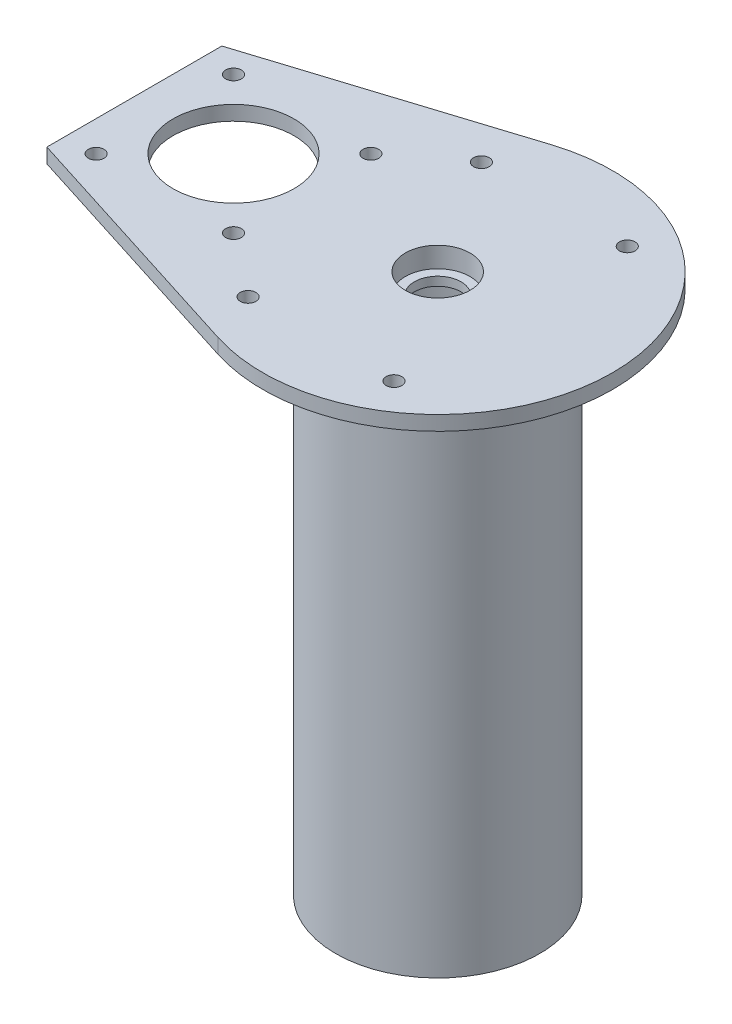
ISO-10303-21;
HEADER;
FILE_DESCRIPTION(('STEP AP214'),'2;1');
FILE_NAME('part.step','',(''),(''),'','','');
FILE_SCHEMA(('AUTOMOTIVE_DESIGN { 1 0 10303 214 1 1 1 1 }'));
ENDSEC;
DATA;
#1=APPLICATION_CONTEXT('core data for automotive mechanical design processes');
#2=APPLICATION_PROTOCOL_DEFINITION('international standard','automotive_design',2000,#1);
#3=PRODUCT_CONTEXT('',#1,'mechanical');
#4=PRODUCT('Part','Part','',(#3));
#5=PRODUCT_RELATED_PRODUCT_CATEGORY('part','',(#4));
#6=PRODUCT_DEFINITION_FORMATION('','',#4);
#7=PRODUCT_DEFINITION_CONTEXT('part definition',#1,'design');
#8=PRODUCT_DEFINITION('design','',#6,#7);
#9=PRODUCT_DEFINITION_SHAPE('','',#8);
#10=(LENGTH_UNIT() NAMED_UNIT(*) SI_UNIT(.MILLI.,.METRE.));
#11=(NAMED_UNIT(*) PLANE_ANGLE_UNIT() SI_UNIT($,.RADIAN.));
#12=(NAMED_UNIT(*) SI_UNIT($,.STERADIAN.) SOLID_ANGLE_UNIT());
#13=UNCERTAINTY_MEASURE_WITH_UNIT(LENGTH_MEASURE(1.E-05),#10,'distance_accuracy_value','');
#14=(GEOMETRIC_REPRESENTATION_CONTEXT(3) GLOBAL_UNCERTAINTY_ASSIGNED_CONTEXT((#13)) GLOBAL_UNIT_ASSIGNED_CONTEXT((#10,
#11,#12)) REPRESENTATION_CONTEXT('',''));
#15=CARTESIAN_POINT('',(0.,0.,0.));
#16=DIRECTION('',(0.,0.,1.));
#17=DIRECTION('',(1.,0.,0.));
#18=AXIS2_PLACEMENT_3D('',#15,#16,#17);
#19=CARTESIAN_POINT('',(0.,0.,0.));
#20=DIRECTION('',(0.,1.,0.));
#21=DIRECTION('',(0.,0.,1.));
#22=AXIS2_PLACEMENT_3D('',#19,#20,#21);
#23=PLANE('',#22);
#24=CARTESIAN_POINT('',(0.,0.,0.));
#25=DIRECTION('',(0.,-1.,0.));
#26=DIRECTION('',(0.,0.,-1.));
#27=AXIS2_PLACEMENT_3D('',#24,#25,#26);
#28=CIRCLE('',#27,30.);
#29=CARTESIAN_POINT('',(0.,0.,-30.));
#30=VERTEX_POINT('',#29);
#31=EDGE_CURVE('E148',#30,#30,#28,.T.);
#32=ORIENTED_EDGE('',*,*,#31,.T.);
#33=EDGE_LOOP('',(#32));
#34=FACE_BOUND('',#33,.T.);
#35=CARTESIAN_POINT('',(0.,0.,0.));
#36=DIRECTION('',(0.,1.,0.));
#37=DIRECTION('',(0.,0.,1.));
#38=AXIS2_PLACEMENT_3D('',#35,#36,#37);
#39=CIRCLE('',#38,16.1);
#40=CARTESIAN_POINT('',(0.,0.,16.1));
#41=VERTEX_POINT('',#40);
#42=EDGE_CURVE('E11',#41,#41,#39,.F.);
#43=ORIENTED_EDGE('',*,*,#42,.F.);
#44=EDGE_LOOP('',(#43));
#45=FACE_BOUND('',#44,.T.);
#46=ADVANCED_FACE('F43',(#34,#45),#23,.F.);
#47=CARTESIAN_POINT('',(0.,-175.,0.));
#48=DIRECTION('',(0.,-1.,0.));
#49=DIRECTION('',(0.,0.,-1.));
#50=AXIS2_PLACEMENT_3D('',#47,#48,#49);
#51=PLANE('',#50);
#52=CARTESIAN_POINT('',(0.,-175.,0.));
#53=DIRECTION('',(0.,-1.,0.));
#54=DIRECTION('',(0.,0.,-1.));
#55=AXIS2_PLACEMENT_3D('',#52,#53,#54);
#56=CIRCLE('',#55,16.1);
#57=CARTESIAN_POINT('',(0.,-175.,-16.1));
#58=VERTEX_POINT('',#57);
#59=EDGE_CURVE('E52',#58,#58,#56,.F.);
#60=ORIENTED_EDGE('',*,*,#59,.F.);
#61=EDGE_LOOP('',(#60));
#62=FACE_BOUND('',#61,.T.);
#63=CARTESIAN_POINT('',(0.,-175.,0.));
#64=DIRECTION('',(0.,-1.,0.));
#65=DIRECTION('',(0.,0.,-1.));
#66=AXIS2_PLACEMENT_3D('',#63,#64,#65);
#67=CIRCLE('',#66,30.);
#68=CARTESIAN_POINT('',(15.,-175.,25.9807621135332));
#69=VERTEX_POINT('',#68);
#70=CARTESIAN_POINT('',(14.9999999999999,-175.,-25.9807621135332));
#71=VERTEX_POINT('',#70);
#72=EDGE_CURVE('E145',#69,#71,#67,.T.);
#73=ORIENTED_EDGE('',*,*,#72,.F.);
#74=CARTESIAN_POINT('',(12.4999999999999,-175.,21.650635094611));
#75=DIRECTION('',(0.,-1.,0.));
#76=DIRECTION('',(0.,0.,-1.));
#77=AXIS2_PLACEMENT_3D('',#74,#75,#76);
#78=CIRCLE('',#77,5.);
#79=CARTESIAN_POINT('',(10.,-175.,17.3205080756887));
#80=VERTEX_POINT('',#79);
#81=EDGE_CURVE('E139',#69,#80,#78,.T.);
#82=ORIENTED_EDGE('',*,*,#81,.T.);
#83=CARTESIAN_POINT('',(0.,-175.,0.));
#84=DIRECTION('',(0.,-1.,0.));
#85=DIRECTION('',(0.,0.,-1.));
#86=AXIS2_PLACEMENT_3D('',#83,#84,#85);
#87=CIRCLE('',#86,20.);
#88=CARTESIAN_POINT('',(9.99999999999988,-175.,-17.3205080756888));
#89=VERTEX_POINT('',#88);
#90=EDGE_CURVE('E134',#80,#89,#87,.F.);
#91=ORIENTED_EDGE('',*,*,#90,.T.);
#92=CARTESIAN_POINT('',(12.5,-175.,-21.650635094611));
#93=DIRECTION('',(0.,-1.,0.));
#94=DIRECTION('',(0.,0.,-1.));
#95=AXIS2_PLACEMENT_3D('',#92,#93,#94);
#96=CIRCLE('',#95,5.);
#97=EDGE_CURVE('E115',#89,#71,#96,.T.);
#98=ORIENTED_EDGE('',*,*,#97,.T.);
#99=EDGE_LOOP('',(#73,#82,#91,#98));
#100=FACE_BOUND('',#99,.T.);
#101=ADVANCED_FACE('F272',(#62,#100),#51,.F.);
#102=CARTESIAN_POINT('',(0.,-180.,0.));
#103=DIRECTION('',(0.,-1.,0.));
#104=DIRECTION('',(0.,0.,-1.));
#105=AXIS2_PLACEMENT_3D('',#102,#103,#104);
#106=PLANE('',#105);
#107=CARTESIAN_POINT('',(0.,-180.,0.));
#108=DIRECTION('',(0.,-1.,0.));
#109=DIRECTION('',(0.,0.,-1.));
#110=AXIS2_PLACEMENT_3D('',#107,#108,#109);
#111=CIRCLE('',#110,11.1);
#112=CARTESIAN_POINT('',(0.,-180.,-11.1));
#113=VERTEX_POINT('',#112);
#114=EDGE_CURVE('E252',#113,#113,#111,.T.);
#115=ORIENTED_EDGE('',*,*,#114,.F.);
#116=EDGE_LOOP('',(#115));
#117=FACE_BOUND('',#116,.T.);
#118=CARTESIAN_POINT('',(0.,-180.,0.));
#119=DIRECTION('',(0.,-1.,0.));
#120=DIRECTION('',(0.,0.,-1.));
#121=AXIS2_PLACEMENT_3D('',#118,#119,#120);
#122=CIRCLE('',#121,35.);
#123=CARTESIAN_POINT('',(0.,-180.,-35.));
#124=VERTEX_POINT('',#123);
#125=EDGE_CURVE('E142',#124,#124,#122,.T.);
#126=ORIENTED_EDGE('',*,*,#125,.T.);
#127=EDGE_LOOP('',(#126));
#128=FACE_BOUND('',#127,.T.);
#129=CARTESIAN_POINT('',(12.4999999999999,-180.,21.650635094611));
#130=DIRECTION('',(0.,-1.,0.));
#131=DIRECTION('',(0.,0.,-1.));
#132=AXIS2_PLACEMENT_3D('',#129,#130,#131);
#133=CIRCLE('',#132,5.);
#134=CARTESIAN_POINT('',(15.,-180.,25.9807621135332));
#135=VERTEX_POINT('',#134);
#136=CARTESIAN_POINT('',(10.,-180.,17.3205080756887));
#137=VERTEX_POINT('',#136);
#138=EDGE_CURVE('E68',#135,#137,#133,.T.);
#139=ORIENTED_EDGE('',*,*,#138,.F.);
#140=CARTESIAN_POINT('',(0.,-180.,0.));
#141=DIRECTION('',(0.,-1.,0.));
#142=DIRECTION('',(0.,0.,-1.));
#143=AXIS2_PLACEMENT_3D('',#140,#141,#142);
#144=CIRCLE('',#143,30.);
#145=CARTESIAN_POINT('',(14.9999999999999,-180.,-25.9807621135332));
#146=VERTEX_POINT('',#145);
#147=EDGE_CURVE('E127',#146,#135,#144,.T.);
#148=ORIENTED_EDGE('',*,*,#147,.F.);
#149=CARTESIAN_POINT('',(12.5,-180.,-21.650635094611));
#150=DIRECTION('',(0.,-1.,0.));
#151=DIRECTION('',(0.,0.,-1.));
#152=AXIS2_PLACEMENT_3D('',#149,#150,#151);
#153=CIRCLE('',#152,5.);
#154=CARTESIAN_POINT('',(9.99999999999988,-180.,-17.3205080756888));
#155=VERTEX_POINT('',#154);
#156=EDGE_CURVE('E112',#155,#146,#153,.T.);
#157=ORIENTED_EDGE('',*,*,#156,.F.);
#158=CARTESIAN_POINT('',(0.,-180.,0.));
#159=DIRECTION('',(0.,1.,0.));
#160=DIRECTION('',(0.,0.,-1.));
#161=AXIS2_PLACEMENT_3D('',#158,#159,#160);
#162=CIRCLE('',#161,20.);
#163=EDGE_CURVE('E121',#137,#155,#162,.T.);
#164=ORIENTED_EDGE('',*,*,#163,.F.);
#165=EDGE_LOOP('',(#139,#148,#157,#164));
#166=FACE_BOUND('',#165,.T.);
#167=ADVANCED_FACE('F125',(#117,#128,#166),#106,.T.);
#168=CARTESIAN_POINT('',(0.,5.,0.));
#169=DIRECTION('',(0.,1.,0.));
#170=DIRECTION('',(0.,0.,1.));
#171=AXIS2_PLACEMENT_3D('',#168,#169,#170);
#172=PLANE('',#171);
#173=CARTESIAN_POINT('',(-25.,5.,40.));
#174=DIRECTION('',(0.,1.,0.));
#175=DIRECTION('',(0.,0.,-1.));
#176=AXIS2_PLACEMENT_3D('',#173,#174,#175);
#177=CIRCLE('',#176,2.685);
#178=CARTESIAN_POINT('',(-25.,5.,37.315));
#179=VERTEX_POINT('',#178);
#180=EDGE_CURVE('E653',#179,#179,#177,.T.);
#181=ORIENTED_EDGE('',*,*,#180,.F.);
#182=EDGE_LOOP('',(#181));
#183=FACE_BOUND('',#182,.T.);
#184=CARTESIAN_POINT('',(25.,5.,40.));
#185=DIRECTION('',(0.,1.,0.));
#186=DIRECTION('',(0.,0.,-1.));
#187=AXIS2_PLACEMENT_3D('',#184,#185,#186);
#188=CIRCLE('',#187,2.685);
#189=CARTESIAN_POINT('',(25.,5.,37.315));
#190=VERTEX_POINT('',#189);
#191=EDGE_CURVE('E654',#190,#190,#188,.T.);
#192=ORIENTED_EDGE('',*,*,#191,.F.);
#193=EDGE_LOOP('',(#192));
#194=FACE_BOUND('',#193,.T.);
#195=CARTESIAN_POINT('',(25.,5.,-40.));
#196=DIRECTION('',(0.,1.,0.));
#197=DIRECTION('',(0.,0.,1.));
#198=AXIS2_PLACEMENT_3D('',#195,#196,#197);
#199=CIRCLE('',#198,2.685);
#200=CARTESIAN_POINT('',(25.,5.,-37.315));
#201=VERTEX_POINT('',#200);
#202=EDGE_CURVE('E657',#201,#201,#199,.T.);
#203=ORIENTED_EDGE('',*,*,#202,.F.);
#204=EDGE_LOOP('',(#203));
#205=FACE_BOUND('',#204,.T.);
#206=CARTESIAN_POINT('',(-25.,5.,-40.));
#207=DIRECTION('',(0.,1.,0.));
#208=DIRECTION('',(0.,0.,1.));
#209=AXIS2_PLACEMENT_3D('',#206,#207,#208);
#210=CIRCLE('',#209,2.685);
#211=CARTESIAN_POINT('',(-25.,5.,-37.315));
#212=VERTEX_POINT('',#211);
#213=EDGE_CURVE('E223',#212,#212,#210,.T.);
#214=ORIENTED_EDGE('',*,*,#213,.F.);
#215=EDGE_LOOP('',(#214));
#216=FACE_BOUND('',#215,.T.);
#217=CARTESIAN_POINT('',(0.,5.,0.));
#218=DIRECTION('',(0.,1.,0.));
#219=DIRECTION('',(0.,0.,1.));
#220=AXIS2_PLACEMENT_3D('',#217,#218,#219);
#221=CIRCLE('',#220,11.1);
#222=CARTESIAN_POINT('',(0.,5.,11.1));
#223=VERTEX_POINT('',#222);
#224=EDGE_CURVE('E155',#223,#223,#221,.T.);
#225=ORIENTED_EDGE('',*,*,#224,.F.);
#226=EDGE_LOOP('',(#225));
#227=FACE_BOUND('',#226,.T.);
#228=CARTESIAN_POINT('',(-93.55,5.,23.55));
#229=DIRECTION('',(0.,1.,0.));
#230=DIRECTION('',(0.,0.,1.));
#231=AXIS2_PLACEMENT_3D('',#228,#229,#230);
#232=CIRCLE('',#231,2.68500000000001);
#233=CARTESIAN_POINT('',(-93.55,5.,26.235));
#234=VERTEX_POINT('',#233);
#235=EDGE_CURVE('E167',#234,#234,#232,.T.);
#236=ORIENTED_EDGE('',*,*,#235,.F.);
#237=EDGE_LOOP('',(#236));
#238=FACE_BOUND('',#237,.T.);
#239=CARTESIAN_POINT('',(-93.55,5.,-23.55));
#240=DIRECTION('',(0.,1.,0.));
#241=DIRECTION('',(0.,0.,1.));
#242=AXIS2_PLACEMENT_3D('',#239,#240,#241);
#243=CIRCLE('',#242,2.68500000000001);
#244=CARTESIAN_POINT('',(-93.55,5.,-20.865));
#245=VERTEX_POINT('',#244);
#246=EDGE_CURVE('E179',#245,#245,#243,.T.);
#247=ORIENTED_EDGE('',*,*,#246,.F.);
#248=EDGE_LOOP('',(#247));
#249=FACE_BOUND('',#248,.T.);
#250=DIRECTION('',(0.,0.,1.));
#251=VECTOR('',#250,1.);
#252=CARTESIAN_POINT('',(-104.,5.,30.));
#253=LINE('',#252,#251);
#254=CARTESIAN_POINT('',(-104.,5.,-30.));
#255=VERTEX_POINT('',#254);
#256=CARTESIAN_POINT('',(-104.,5.,30.));
#257=VERTEX_POINT('',#256);
#258=EDGE_CURVE('E185',#255,#257,#253,.T.);
#259=ORIENTED_EDGE('',*,*,#258,.T.);
#260=DIRECTION('',(0.953332185369574,0.,0.301923408066469));
#261=VECTOR('',#260,1.);
#262=CARTESIAN_POINT('',(-104.,5.,30.));
#263=LINE('',#262,#261);
#264=CARTESIAN_POINT('',(-18.1154044839881,5.,57.1999311221745));
#265=VERTEX_POINT('',#264);
#266=EDGE_CURVE('E188',#257,#265,#263,.T.);
#267=ORIENTED_EDGE('',*,*,#266,.T.);
#268=CARTESIAN_POINT('',(0.,5.,0.));
#269=DIRECTION('',(0.,1.,0.));
#270=DIRECTION('',(0.,0.,1.));
#271=AXIS2_PLACEMENT_3D('',#268,#269,#270);
#272=CIRCLE('',#271,60.);
#273=CARTESIAN_POINT('',(-18.1154044839882,5.,-57.1999311221745));
#274=VERTEX_POINT('',#273);
#275=EDGE_CURVE('E191',#265,#274,#272,.T.);
#276=ORIENTED_EDGE('',*,*,#275,.T.);
#277=DIRECTION('',(-0.953332185369574,0.,0.301923408066469));
#278=VECTOR('',#277,1.);
#279=CARTESIAN_POINT('',(-104.,5.,-30.));
#280=LINE('',#279,#278);
#281=EDGE_CURVE('E193',#274,#255,#280,.T.);
#282=ORIENTED_EDGE('',*,*,#281,.T.);
#283=EDGE_LOOP('',(#259,#267,#276,#282));
#284=FACE_BOUND('',#283,.T.);
#285=CARTESIAN_POINT('',(-46.45,5.,-23.55));
#286=DIRECTION('',(0.,1.,0.));
#287=DIRECTION('',(0.,0.,1.));
#288=AXIS2_PLACEMENT_3D('',#285,#286,#287);
#289=CIRCLE('',#288,2.685);
#290=CARTESIAN_POINT('',(-46.45,5.,-20.865));
#291=VERTEX_POINT('',#290);
#292=EDGE_CURVE('E173',#291,#291,#289,.T.);
#293=ORIENTED_EDGE('',*,*,#292,.F.);
#294=EDGE_LOOP('',(#293));
#295=FACE_BOUND('',#294,.T.);
#296=CARTESIAN_POINT('',(-46.45,5.,23.55));
#297=DIRECTION('',(0.,1.,0.));
#298=DIRECTION('',(0.,0.,1.));
#299=AXIS2_PLACEMENT_3D('',#296,#297,#298);
#300=CIRCLE('',#299,2.685);
#301=CARTESIAN_POINT('',(-46.45,5.,26.235));
#302=VERTEX_POINT('',#301);
#303=EDGE_CURVE('E161',#302,#302,#300,.T.);
#304=ORIENTED_EDGE('',*,*,#303,.F.);
#305=EDGE_LOOP('',(#304));
#306=FACE_BOUND('',#305,.T.);
#307=CARTESIAN_POINT('',(-70.,5.,0.));
#308=DIRECTION('',(0.,1.,0.));
#309=DIRECTION('',(0.,0.,1.));
#310=AXIS2_PLACEMENT_3D('',#307,#308,#309);
#311=CIRCLE('',#310,20.75);
#312=CARTESIAN_POINT('',(-70.,5.,20.75));
#313=VERTEX_POINT('',#312);
#314=EDGE_CURVE('E152',#313,#313,#311,.T.);
#315=ORIENTED_EDGE('',*,*,#314,.F.);
#316=EDGE_LOOP('',(#315));
#317=FACE_BOUND('',#316,.T.);
#318=ADVANCED_FACE('F305',(#183,#194,#205,#216,#227,#238,#249,#284,#295,#306,#317),#172,.T.);
#319=CARTESIAN_POINT('',(-25.,0.,40.));
#320=DIRECTION('',(0.,1.,0.));
#321=DIRECTION('',(0.,0.,1.));
#322=AXIS2_PLACEMENT_3D('',#319,#320,#321);
#323=CIRCLE('',#322,2.685);
#324=CARTESIAN_POINT('',(-25.,0.,42.685));
#325=VERTEX_POINT('',#324);
#326=EDGE_CURVE('E47',#325,#325,#323,.T.);
#327=ORIENTED_EDGE('',*,*,#326,.T.);
#328=EDGE_LOOP('',(#327));
#329=FACE_BOUND('',#328,.T.);
#330=CARTESIAN_POINT('',(25.,0.,40.));
#331=DIRECTION('',(0.,1.,0.));
#332=DIRECTION('',(0.,0.,1.));
#333=AXIS2_PLACEMENT_3D('',#330,#331,#332);
#334=CIRCLE('',#333,2.685);
#335=CARTESIAN_POINT('',(25.,0.,42.685));
#336=VERTEX_POINT('',#335);
#337=EDGE_CURVE('E225',#336,#336,#334,.T.);
#338=ORIENTED_EDGE('',*,*,#337,.T.);
#339=EDGE_LOOP('',(#338));
#340=FACE_BOUND('',#339,.T.);
#341=CARTESIAN_POINT('',(25.,0.,-40.));
#342=DIRECTION('',(0.,1.,0.));
#343=DIRECTION('',(0.,0.,1.));
#344=AXIS2_PLACEMENT_3D('',#341,#342,#343);
#345=CIRCLE('',#344,2.685);
#346=CARTESIAN_POINT('',(25.,0.,-37.315));
#347=VERTEX_POINT('',#346);
#348=EDGE_CURVE('E222',#347,#347,#345,.T.);
#349=ORIENTED_EDGE('',*,*,#348,.T.);
#350=EDGE_LOOP('',(#349));
#351=FACE_BOUND('',#350,.T.);
#352=CARTESIAN_POINT('',(-25.,0.,-40.));
#353=DIRECTION('',(0.,1.,0.));
#354=DIRECTION('',(0.,0.,1.));
#355=AXIS2_PLACEMENT_3D('',#352,#353,#354);
#356=CIRCLE('',#355,2.685);
#357=CARTESIAN_POINT('',(-25.,0.,-37.315));
#358=VERTEX_POINT('',#357);
#359=EDGE_CURVE('E219',#358,#358,#356,.T.);
#360=ORIENTED_EDGE('',*,*,#359,.T.);
#361=EDGE_LOOP('',(#360));
#362=FACE_BOUND('',#361,.T.);
#363=CARTESIAN_POINT('',(0.,0.,0.));
#364=DIRECTION('',(0.,1.,0.));
#365=DIRECTION('',(0.,0.,1.));
#366=AXIS2_PLACEMENT_3D('',#363,#364,#365);
#367=CIRCLE('',#366,35.);
#368=CARTESIAN_POINT('',(0.,0.,35.));
#369=VERTEX_POINT('',#368);
#370=EDGE_CURVE('E214',#369,#369,#367,.F.);
#371=ORIENTED_EDGE('',*,*,#370,.F.);
#372=EDGE_LOOP('',(#371));
#373=FACE_BOUND('',#372,.T.);
#374=DIRECTION('',(0.,0.,1.));
#375=VECTOR('',#374,1.);
#376=CARTESIAN_POINT('',(-104.,0.,30.));
#377=LINE('',#376,#375);
#378=CARTESIAN_POINT('',(-104.,0.,-30.));
#379=VERTEX_POINT('',#378);
#380=CARTESIAN_POINT('',(-104.,0.,30.));
#381=VERTEX_POINT('',#380);
#382=EDGE_CURVE('E182',#379,#381,#377,.T.);
#383=ORIENTED_EDGE('',*,*,#382,.F.);
#384=DIRECTION('',(-0.953332185369574,0.,0.301923408066469));
#385=VECTOR('',#384,1.);
#386=CARTESIAN_POINT('',(-104.,0.,-30.));
#387=LINE('',#386,#385);
#388=CARTESIAN_POINT('',(-18.1154044839882,0.,-57.1999311221745));
#389=VERTEX_POINT('',#388);
#390=EDGE_CURVE('E189',#389,#379,#387,.T.);
#391=ORIENTED_EDGE('',*,*,#390,.F.);
#392=CARTESIAN_POINT('',(0.,0.,0.));
#393=DIRECTION('',(0.,1.,0.));
#394=DIRECTION('',(0.,0.,1.));
#395=AXIS2_PLACEMENT_3D('',#392,#393,#394);
#396=CIRCLE('',#395,60.);
#397=CARTESIAN_POINT('',(-18.1154044839881,0.,57.1999311221745));
#398=VERTEX_POINT('',#397);
#399=EDGE_CURVE('E200',#398,#389,#396,.T.);
#400=ORIENTED_EDGE('',*,*,#399,.F.);
#401=DIRECTION('',(0.953332185369574,0.,0.301923408066469));
#402=VECTOR('',#401,1.);
#403=CARTESIAN_POINT('',(-104.,0.,30.));
#404=LINE('',#403,#402);
#405=EDGE_CURVE('E198',#381,#398,#404,.T.);
#406=ORIENTED_EDGE('',*,*,#405,.F.);
#407=EDGE_LOOP('',(#383,#391,#400,#406));
#408=FACE_BOUND('',#407,.T.);
#409=CARTESIAN_POINT('',(-93.55,0.,-23.55));
#410=DIRECTION('',(0.,1.,0.));
#411=DIRECTION('',(0.,0.,1.));
#412=AXIS2_PLACEMENT_3D('',#409,#410,#411);
#413=CIRCLE('',#412,2.68500000000001);
#414=CARTESIAN_POINT('',(-93.55,0.,-20.865));
#415=VERTEX_POINT('',#414);
#416=EDGE_CURVE('E176',#415,#415,#413,.T.);
#417=ORIENTED_EDGE('',*,*,#416,.T.);
#418=EDGE_LOOP('',(#417));
#419=FACE_BOUND('',#418,.T.);
#420=CARTESIAN_POINT('',(-46.45,0.,-23.55));
#421=DIRECTION('',(0.,1.,0.));
#422=DIRECTION('',(0.,0.,1.));
#423=AXIS2_PLACEMENT_3D('',#420,#421,#422);
#424=CIRCLE('',#423,2.685);
#425=CARTESIAN_POINT('',(-46.45,0.,-20.865));
#426=VERTEX_POINT('',#425);
#427=EDGE_CURVE('E170',#426,#426,#424,.T.);
#428=ORIENTED_EDGE('',*,*,#427,.T.);
#429=EDGE_LOOP('',(#428));
#430=FACE_BOUND('',#429,.T.);
#431=CARTESIAN_POINT('',(-93.55,0.,23.55));
#432=DIRECTION('',(0.,1.,0.));
#433=DIRECTION('',(0.,0.,1.));
#434=AXIS2_PLACEMENT_3D('',#431,#432,#433);
#435=CIRCLE('',#434,2.68500000000001);
#436=CARTESIAN_POINT('',(-93.55,0.,26.235));
#437=VERTEX_POINT('',#436);
#438=EDGE_CURVE('E164',#437,#437,#435,.T.);
#439=ORIENTED_EDGE('',*,*,#438,.T.);
#440=EDGE_LOOP('',(#439));
#441=FACE_BOUND('',#440,.T.);
#442=CARTESIAN_POINT('',(-46.45,0.,23.55));
#443=DIRECTION('',(0.,1.,0.));
#444=DIRECTION('',(0.,0.,1.));
#445=AXIS2_PLACEMENT_3D('',#442,#443,#444);
#446=CIRCLE('',#445,2.685);
#447=CARTESIAN_POINT('',(-46.45,0.,26.235));
#448=VERTEX_POINT('',#447);
#449=EDGE_CURVE('E160',#448,#448,#446,.T.);
#450=ORIENTED_EDGE('',*,*,#449,.T.);
#451=EDGE_LOOP('',(#450));
#452=FACE_BOUND('',#451,.T.);
#453=CARTESIAN_POINT('',(-70.,0.,0.));
#454=DIRECTION('',(0.,1.,0.));
#455=DIRECTION('',(0.,0.,1.));
#456=AXIS2_PLACEMENT_3D('',#453,#454,#455);
#457=CIRCLE('',#456,20.75);
#458=CARTESIAN_POINT('',(-70.,0.,20.75));
#459=VERTEX_POINT('',#458);
#460=EDGE_CURVE('E151',#459,#459,#457,.T.);
#461=ORIENTED_EDGE('',*,*,#460,.T.);
#462=EDGE_LOOP('',(#461));
#463=FACE_BOUND('',#462,.T.);
#464=ADVANCED_FACE('F296',(#329,#340,#351,#362,#373,#408,#419,#430,#441,#452,#463),#23,.F.);
#465=CARTESIAN_POINT('',(-104.,5.,30.));
#466=DIRECTION('',(1.,0.,0.));
#467=DIRECTION('',(0.,0.,-1.));
#468=AXIS2_PLACEMENT_3D('',#465,#466,#467);
#469=PLANE('',#468);
#470=ORIENTED_EDGE('',*,*,#382,.T.);
#471=DIRECTION('',(0.,-1.,0.));
#472=VECTOR('',#471,1.);
#473=CARTESIAN_POINT('',(-104.,5.,30.));
#474=LINE('',#473,#472);
#475=EDGE_CURVE('E211',#257,#381,#474,.T.);
#476=ORIENTED_EDGE('',*,*,#475,.F.);
#477=ORIENTED_EDGE('',*,*,#258,.F.);
#478=DIRECTION('',(0.,-1.,0.));
#479=VECTOR('',#478,1.);
#480=CARTESIAN_POINT('',(-104.,5.,-30.));
#481=LINE('',#480,#479);
#482=EDGE_CURVE('E195',#255,#379,#481,.T.);
#483=ORIENTED_EDGE('',*,*,#482,.T.);
#484=EDGE_LOOP('',(#470,#476,#477,#483));
#485=FACE_BOUND('',#484,.T.);
#486=ADVANCED_FACE('F45',(#485),#469,.F.);
#487=CARTESIAN_POINT('',(-104.,5.,30.));
#488=DIRECTION('',(0.301923408066469,0.,-0.953332185369574));
#489=DIRECTION('',(-0.953332185369574,0.,-0.301923408066469));
#490=AXIS2_PLACEMENT_3D('',#487,#488,#489);
#491=PLANE('',#490);
#492=ORIENTED_EDGE('',*,*,#405,.T.);
#493=DIRECTION('',(0.,-1.,0.));
#494=VECTOR('',#493,1.);
#495=CARTESIAN_POINT('',(-18.1154044839881,5.,57.1999311221745));
#496=LINE('',#495,#494);
#497=EDGE_CURVE('E208',#265,#398,#496,.T.);
#498=ORIENTED_EDGE('',*,*,#497,.F.);
#499=ORIENTED_EDGE('',*,*,#266,.F.);
#500=ORIENTED_EDGE('',*,*,#475,.T.);
#501=EDGE_LOOP('',(#492,#498,#499,#500));
#502=FACE_BOUND('',#501,.T.);
#503=ADVANCED_FACE('F311',(#502),#491,.F.);
#504=CARTESIAN_POINT('',(0.,5.,0.));
#505=DIRECTION('',(0.,-1.,0.));
#506=DIRECTION('',(0.,0.,-1.));
#507=AXIS2_PLACEMENT_3D('',#504,#505,#506);
#508=CYLINDRICAL_SURFACE('',#507,60.);
#509=ORIENTED_EDGE('',*,*,#399,.T.);
#510=DIRECTION('',(0.,-1.,0.));
#511=VECTOR('',#510,1.);
#512=CARTESIAN_POINT('',(-18.1154044839882,5.,-57.1999311221745));
#513=LINE('',#512,#511);
#514=EDGE_CURVE('E205',#274,#389,#513,.T.);
#515=ORIENTED_EDGE('',*,*,#514,.F.);
#516=ORIENTED_EDGE('',*,*,#275,.F.);
#517=ORIENTED_EDGE('',*,*,#497,.T.);
#518=EDGE_LOOP('',(#509,#515,#516,#517));
#519=FACE_BOUND('',#518,.T.);
#520=ADVANCED_FACE('F366',(#519),#508,.T.);
#521=CARTESIAN_POINT('',(-104.,5.,-30.));
#522=DIRECTION('',(0.301923408066469,0.,0.953332185369574));
#523=DIRECTION('',(0.953332185369574,0.,-0.301923408066469));
#524=AXIS2_PLACEMENT_3D('',#521,#522,#523);
#525=PLANE('',#524);
#526=ORIENTED_EDGE('',*,*,#390,.T.);
#527=ORIENTED_EDGE('',*,*,#482,.F.);
#528=ORIENTED_EDGE('',*,*,#281,.F.);
#529=ORIENTED_EDGE('',*,*,#514,.T.);
#530=EDGE_LOOP('',(#526,#527,#528,#529));
#531=FACE_BOUND('',#530,.T.);
#532=ADVANCED_FACE('F361',(#531),#525,.F.);
#533=CARTESIAN_POINT('',(-93.55,5.,-23.55));
#534=DIRECTION('',(0.,-1.,0.));
#535=DIRECTION('',(0.,0.,-1.));
#536=AXIS2_PLACEMENT_3D('',#533,#534,#535);
#537=CYLINDRICAL_SURFACE('',#536,2.68500000000001);
#538=ORIENTED_EDGE('',*,*,#246,.T.);
#539=EDGE_LOOP('',(#538));
#540=FACE_BOUND('',#539,.T.);
#541=ORIENTED_EDGE('',*,*,#416,.F.);
#542=EDGE_LOOP('',(#541));
#543=FACE_BOUND('',#542,.T.);
#544=ADVANCED_FACE('F358',(#540,#543),#537,.F.);
#545=CARTESIAN_POINT('',(-46.45,5.,-23.55));
#546=DIRECTION('',(0.,-1.,0.));
#547=DIRECTION('',(0.,0.,-1.));
#548=AXIS2_PLACEMENT_3D('',#545,#546,#547);
#549=CYLINDRICAL_SURFACE('',#548,2.685);
#550=ORIENTED_EDGE('',*,*,#292,.T.);
#551=EDGE_LOOP('',(#550));
#552=FACE_BOUND('',#551,.T.);
#553=ORIENTED_EDGE('',*,*,#427,.F.);
#554=EDGE_LOOP('',(#553));
#555=FACE_BOUND('',#554,.T.);
#556=ADVANCED_FACE('F354',(#552,#555),#549,.F.);
#557=CARTESIAN_POINT('',(-93.55,5.,23.55));
#558=DIRECTION('',(0.,-1.,0.));
#559=DIRECTION('',(0.,0.,-1.));
#560=AXIS2_PLACEMENT_3D('',#557,#558,#559);
#561=CYLINDRICAL_SURFACE('',#560,2.68500000000001);
#562=ORIENTED_EDGE('',*,*,#235,.T.);
#563=EDGE_LOOP('',(#562));
#564=FACE_BOUND('',#563,.T.);
#565=ORIENTED_EDGE('',*,*,#438,.F.);
#566=EDGE_LOOP('',(#565));
#567=FACE_BOUND('',#566,.T.);
#568=ADVANCED_FACE('F350',(#564,#567),#561,.F.);
#569=CARTESIAN_POINT('',(-46.45,5.,23.55));
#570=DIRECTION('',(0.,-1.,0.));
#571=DIRECTION('',(0.,0.,-1.));
#572=AXIS2_PLACEMENT_3D('',#569,#570,#571);
#573=CYLINDRICAL_SURFACE('',#572,2.685);
#574=ORIENTED_EDGE('',*,*,#303,.T.);
#575=EDGE_LOOP('',(#574));
#576=FACE_BOUND('',#575,.T.);
#577=ORIENTED_EDGE('',*,*,#449,.F.);
#578=EDGE_LOOP('',(#577));
#579=FACE_BOUND('',#578,.T.);
#580=ADVANCED_FACE('F345',(#576,#579),#573,.F.);
#581=CARTESIAN_POINT('',(0.,5.,0.));
#582=DIRECTION('',(0.,-1.,0.));
#583=DIRECTION('',(0.,0.,-1.));
#584=AXIS2_PLACEMENT_3D('',#581,#582,#583);
#585=CYLINDRICAL_SURFACE('',#584,11.1);
#586=ORIENTED_EDGE('',*,*,#224,.T.);
#587=EDGE_LOOP('',(#586));
#588=FACE_BOUND('',#587,.T.);
#589=CARTESIAN_POINT('',(0.,-2.,0.));
#590=DIRECTION('',(0.,-1.,0.));
#591=DIRECTION('',(0.,0.,-1.));
#592=AXIS2_PLACEMENT_3D('',#589,#590,#591);
#593=CIRCLE('',#592,11.1);
#594=CARTESIAN_POINT('',(0.,-2.,-11.1));
#595=VERTEX_POINT('',#594);
#596=EDGE_CURVE('E245',#595,#595,#593,.T.);
#597=ORIENTED_EDGE('',*,*,#596,.T.);
#598=EDGE_LOOP('',(#597));
#599=FACE_BOUND('',#598,.T.);
#600=ADVANCED_FACE('F336',(#588,#599),#585,.F.);
#601=CARTESIAN_POINT('',(-70.,5.,0.));
#602=DIRECTION('',(0.,-1.,0.));
#603=DIRECTION('',(0.,0.,-1.));
#604=AXIS2_PLACEMENT_3D('',#601,#602,#603);
#605=CYLINDRICAL_SURFACE('',#604,20.75);
#606=ORIENTED_EDGE('',*,*,#314,.T.);
#607=EDGE_LOOP('',(#606));
#608=FACE_BOUND('',#607,.T.);
#609=ORIENTED_EDGE('',*,*,#460,.F.);
#610=EDGE_LOOP('',(#609));
#611=FACE_BOUND('',#610,.T.);
#612=ADVANCED_FACE('F334',(#608,#611),#605,.F.);
#613=CARTESIAN_POINT('',(0.,-175.,0.));
#614=DIRECTION('',(0.,1.,0.));
#615=DIRECTION('',(0.,0.,1.));
#616=AXIS2_PLACEMENT_3D('',#613,#614,#615);
#617=CYLINDRICAL_SURFACE('',#616,35.);
#618=ORIENTED_EDGE('',*,*,#370,.T.);
#619=EDGE_LOOP('',(#618));
#620=FACE_BOUND('',#619,.T.);
#621=ORIENTED_EDGE('',*,*,#125,.F.);
#622=EDGE_LOOP('',(#621));
#623=FACE_BOUND('',#622,.T.);
#624=ADVANCED_FACE('F289',(#620,#623),#617,.T.);
#625=CARTESIAN_POINT('',(0.,-175.,0.));
#626=DIRECTION('',(0.,1.,0.));
#627=DIRECTION('',(0.,0.,1.));
#628=AXIS2_PLACEMENT_3D('',#625,#626,#627);
#629=CYLINDRICAL_SURFACE('',#628,30.);
#630=DIRECTION('',(0.,-1.,0.));
#631=VECTOR('',#630,1.);
#632=CARTESIAN_POINT('',(15.,-174.,25.9807621135332));
#633=LINE('',#632,#631);
#634=EDGE_CURVE('E132',#69,#135,#633,.T.);
#635=ORIENTED_EDGE('',*,*,#634,.F.);
#636=ORIENTED_EDGE('',*,*,#72,.T.);
#637=DIRECTION('',(0.,-1.,0.));
#638=VECTOR('',#637,1.);
#639=CARTESIAN_POINT('',(14.9999999999999,-174.,-25.9807621135332));
#640=LINE('',#639,#638);
#641=EDGE_CURVE('E117',#71,#146,#640,.T.);
#642=ORIENTED_EDGE('',*,*,#641,.T.);
#643=ORIENTED_EDGE('',*,*,#147,.T.);
#644=EDGE_LOOP('',(#635,#636,#642,#643));
#645=FACE_BOUND('',#644,.T.);
#646=ORIENTED_EDGE('',*,*,#31,.F.);
#647=EDGE_LOOP('',(#646));
#648=FACE_BOUND('',#647,.T.);
#649=ADVANCED_FACE('F279',(#645,#648),#629,.F.);
#650=CARTESIAN_POINT('',(12.4999999999999,-174.,21.650635094611));
#651=DIRECTION('',(0.,-1.,0.));
#652=DIRECTION('',(0.,0.,-1.));
#653=AXIS2_PLACEMENT_3D('',#650,#651,#652);
#654=CYLINDRICAL_SURFACE('',#653,5.);
#655=ORIENTED_EDGE('',*,*,#634,.T.);
#656=ORIENTED_EDGE('',*,*,#138,.T.);
#657=DIRECTION('',(0.,-1.,0.));
#658=VECTOR('',#657,1.);
#659=CARTESIAN_POINT('',(10.,-174.,17.3205080756887));
#660=LINE('',#659,#658);
#661=EDGE_CURVE('E118',#80,#137,#660,.T.);
#662=ORIENTED_EDGE('',*,*,#661,.F.);
#663=ORIENTED_EDGE('',*,*,#81,.F.);
#664=EDGE_LOOP('',(#655,#656,#662,#663));
#665=FACE_BOUND('',#664,.T.);
#666=ADVANCED_FACE('F281',(#665),#654,.F.);
#667=CARTESIAN_POINT('',(12.5,-174.,-21.650635094611));
#668=DIRECTION('',(0.,-1.,0.));
#669=DIRECTION('',(0.,0.,-1.));
#670=AXIS2_PLACEMENT_3D('',#667,#668,#669);
#671=CYLINDRICAL_SURFACE('',#670,5.);
#672=DIRECTION('',(0.,-1.,0.));
#673=VECTOR('',#672,1.);
#674=CARTESIAN_POINT('',(9.99999999999988,-174.,-17.3205080756888));
#675=LINE('',#674,#673);
#676=EDGE_CURVE('E60',#89,#155,#675,.T.);
#677=ORIENTED_EDGE('',*,*,#676,.T.);
#678=ORIENTED_EDGE('',*,*,#156,.T.);
#679=ORIENTED_EDGE('',*,*,#641,.F.);
#680=ORIENTED_EDGE('',*,*,#97,.F.);
#681=EDGE_LOOP('',(#677,#678,#679,#680));
#682=FACE_BOUND('',#681,.T.);
#683=ADVANCED_FACE('F110',(#682),#671,.F.);
#684=CARTESIAN_POINT('',(0.,-174.,0.));
#685=DIRECTION('',(0.,-1.,0.));
#686=DIRECTION('',(0.,0.,-1.));
#687=AXIS2_PLACEMENT_3D('',#684,#685,#686);
#688=CYLINDRICAL_SURFACE('',#687,20.);
#689=ORIENTED_EDGE('',*,*,#661,.T.);
#690=ORIENTED_EDGE('',*,*,#163,.T.);
#691=ORIENTED_EDGE('',*,*,#676,.F.);
#692=ORIENTED_EDGE('',*,*,#90,.F.);
#693=EDGE_LOOP('',(#689,#690,#691,#692));
#694=FACE_BOUND('',#693,.T.);
#695=ADVANCED_FACE('F122',(#694),#688,.T.);
#696=CARTESIAN_POINT('',(0.,-170.,0.));
#697=DIRECTION('',(0.,-1.,0.));
#698=DIRECTION('',(0.,0.,-1.));
#699=AXIS2_PLACEMENT_3D('',#696,#697,#698);
#700=CYLINDRICAL_SURFACE('',#699,16.1);
#701=CARTESIAN_POINT('',(0.,-170.,0.));
#702=DIRECTION('',(0.,1.,0.));
#703=DIRECTION('',(0.,0.,1.));
#704=AXIS2_PLACEMENT_3D('',#701,#702,#703);
#705=CIRCLE('',#704,16.1);
#706=CARTESIAN_POINT('',(0.,-170.,16.1));
#707=VERTEX_POINT('',#706);
#708=EDGE_CURVE('E258',#707,#707,#705,.T.);
#709=ORIENTED_EDGE('',*,*,#708,.F.);
#710=EDGE_LOOP('',(#709));
#711=FACE_BOUND('',#710,.T.);
#712=ORIENTED_EDGE('',*,*,#59,.T.);
#713=EDGE_LOOP('',(#712));
#714=FACE_BOUND('',#713,.T.);
#715=ADVANCED_FACE('F266',(#711,#714),#700,.T.);
#716=CARTESIAN_POINT('',(0.,-170.,0.));
#717=DIRECTION('',(0.,1.,0.));
#718=DIRECTION('',(0.,0.,1.));
#719=AXIS2_PLACEMENT_3D('',#716,#717,#718);
#720=PLANE('',#719);
#721=CARTESIAN_POINT('',(0.,-170.,0.));
#722=DIRECTION('',(0.,1.,0.));
#723=DIRECTION('',(0.,0.,1.));
#724=AXIS2_PLACEMENT_3D('',#721,#722,#723);
#725=CIRCLE('',#724,8.);
#726=CARTESIAN_POINT('',(0.,-170.,8.));
#727=VERTEX_POINT('',#726);
#728=EDGE_CURVE('E248',#727,#727,#725,.F.);
#729=ORIENTED_EDGE('',*,*,#728,.T.);
#730=EDGE_LOOP('',(#729));
#731=FACE_BOUND('',#730,.T.);
#732=ORIENTED_EDGE('',*,*,#708,.T.);
#733=EDGE_LOOP('',(#732));
#734=FACE_BOUND('',#733,.T.);
#735=ADVANCED_FACE('F264',(#731,#734),#720,.T.);
#736=CARTESIAN_POINT('',(0.,-173.,0.));
#737=DIRECTION('',(0.,-1.,0.));
#738=DIRECTION('',(0.,0.,-1.));
#739=AXIS2_PLACEMENT_3D('',#736,#737,#738);
#740=CYLINDRICAL_SURFACE('',#739,11.1);
#741=CARTESIAN_POINT('',(0.,-173.,0.));
#742=DIRECTION('',(0.,-1.,0.));
#743=DIRECTION('',(0.,0.,-1.));
#744=AXIS2_PLACEMENT_3D('',#741,#742,#743);
#745=CIRCLE('',#744,11.1);
#746=CARTESIAN_POINT('',(0.,-173.,-11.1));
#747=VERTEX_POINT('',#746);
#748=EDGE_CURVE('E255',#747,#747,#745,.T.);
#749=ORIENTED_EDGE('',*,*,#748,.F.);
#750=EDGE_LOOP('',(#749));
#751=FACE_BOUND('',#750,.T.);
#752=ORIENTED_EDGE('',*,*,#114,.T.);
#753=EDGE_LOOP('',(#752));
#754=FACE_BOUND('',#753,.T.);
#755=ADVANCED_FACE('F521',(#751,#754),#740,.F.);
#756=CARTESIAN_POINT('',(0.,-173.,0.));
#757=DIRECTION('',(0.,-1.,0.));
#758=DIRECTION('',(0.,0.,-1.));
#759=AXIS2_PLACEMENT_3D('',#756,#757,#758);
#760=PLANE('',#759);
#761=CARTESIAN_POINT('',(0.,-173.,0.));
#762=DIRECTION('',(0.,-1.,0.));
#763=DIRECTION('',(0.,0.,-1.));
#764=AXIS2_PLACEMENT_3D('',#761,#762,#763);
#765=CIRCLE('',#764,8.);
#766=CARTESIAN_POINT('',(0.,-173.,-8.));
#767=VERTEX_POINT('',#766);
#768=EDGE_CURVE('E249',#767,#767,#765,.T.);
#769=ORIENTED_EDGE('',*,*,#768,.F.);
#770=EDGE_LOOP('',(#769));
#771=FACE_BOUND('',#770,.T.);
#772=ORIENTED_EDGE('',*,*,#748,.T.);
#773=EDGE_LOOP('',(#772));
#774=FACE_BOUND('',#773,.T.);
#775=ADVANCED_FACE('F517',(#771,#774),#760,.T.);
#776=CARTESIAN_POINT('',(0.,5.00100000000001,0.));
#777=DIRECTION('',(0.,-1.,0.));
#778=DIRECTION('',(0.,0.,-1.));
#779=AXIS2_PLACEMENT_3D('',#776,#777,#778);
#780=CYLINDRICAL_SURFACE('',#779,8.);
#781=ORIENTED_EDGE('',*,*,#728,.F.);
#782=EDGE_LOOP('',(#781));
#783=FACE_BOUND('',#782,.T.);
#784=ORIENTED_EDGE('',*,*,#768,.T.);
#785=EDGE_LOOP('',(#784));
#786=FACE_BOUND('',#785,.T.);
#787=ADVANCED_FACE('F448',(#783,#786),#780,.F.);
#788=CARTESIAN_POINT('',(0.,-2.,0.));
#789=DIRECTION('',(0.,1.,0.));
#790=DIRECTION('',(0.,0.,1.));
#791=AXIS2_PLACEMENT_3D('',#788,#789,#790);
#792=CYLINDRICAL_SURFACE('',#791,16.1);
#793=ORIENTED_EDGE('',*,*,#42,.T.);
#794=EDGE_LOOP('',(#793));
#795=FACE_BOUND('',#794,.T.);
#796=CARTESIAN_POINT('',(0.,-5.,0.));
#797=DIRECTION('',(0.,-1.,0.));
#798=DIRECTION('',(0.,0.,-1.));
#799=AXIS2_PLACEMENT_3D('',#796,#797,#798);
#800=CIRCLE('',#799,16.1);
#801=CARTESIAN_POINT('',(0.,-5.,-16.1));
#802=VERTEX_POINT('',#801);
#803=EDGE_CURVE('E239',#802,#802,#800,.T.);
#804=ORIENTED_EDGE('',*,*,#803,.F.);
#805=EDGE_LOOP('',(#804));
#806=FACE_BOUND('',#805,.T.);
#807=ADVANCED_FACE('F441',(#795,#806),#792,.T.);
#808=CARTESIAN_POINT('',(0.,-2.,0.));
#809=DIRECTION('',(0.,-1.,0.));
#810=DIRECTION('',(0.,0.,-1.));
#811=AXIS2_PLACEMENT_3D('',#808,#809,#810);
#812=PLANE('',#811);
#813=CARTESIAN_POINT('',(0.,-2.,0.));
#814=DIRECTION('',(0.,-1.,0.));
#815=DIRECTION('',(0.,0.,-1.));
#816=AXIS2_PLACEMENT_3D('',#813,#814,#815);
#817=CIRCLE('',#816,8.);
#818=CARTESIAN_POINT('',(0.,-2.,-8.));
#819=VERTEX_POINT('',#818);
#820=EDGE_CURVE('E230',#819,#819,#817,.T.);
#821=ORIENTED_EDGE('',*,*,#820,.T.);
#822=EDGE_LOOP('',(#821));
#823=FACE_BOUND('',#822,.T.);
#824=ORIENTED_EDGE('',*,*,#596,.F.);
#825=EDGE_LOOP('',(#824));
#826=FACE_BOUND('',#825,.T.);
#827=ADVANCED_FACE('F432',(#823,#826),#812,.F.);
#828=CARTESIAN_POINT('',(0.,-5.,0.));
#829=DIRECTION('',(0.,-1.,0.));
#830=DIRECTION('',(0.,0.,-1.));
#831=AXIS2_PLACEMENT_3D('',#828,#829,#830);
#832=PLANE('',#831);
#833=ORIENTED_EDGE('',*,*,#803,.T.);
#834=EDGE_LOOP('',(#833));
#835=FACE_BOUND('',#834,.T.);
#836=CARTESIAN_POINT('',(0.,-5.,0.));
#837=DIRECTION('',(0.,-1.,0.));
#838=DIRECTION('',(0.,0.,-1.));
#839=AXIS2_PLACEMENT_3D('',#836,#837,#838);
#840=CIRCLE('',#839,8.);
#841=CARTESIAN_POINT('',(0.,-5.,-8.));
#842=VERTEX_POINT('',#841);
#843=EDGE_CURVE('E234',#842,#842,#840,.T.);
#844=ORIENTED_EDGE('',*,*,#843,.F.);
#845=EDGE_LOOP('',(#844));
#846=FACE_BOUND('',#845,.T.);
#847=ADVANCED_FACE('F422',(#835,#846),#832,.T.);
#848=CARTESIAN_POINT('',(0.,-5.,0.));
#849=DIRECTION('',(0.,1.,0.));
#850=DIRECTION('',(0.,0.,1.));
#851=AXIS2_PLACEMENT_3D('',#848,#849,#850);
#852=CYLINDRICAL_SURFACE('',#851,8.);
#853=ORIENTED_EDGE('',*,*,#843,.T.);
#854=EDGE_LOOP('',(#853));
#855=FACE_BOUND('',#854,.T.);
#856=ORIENTED_EDGE('',*,*,#820,.F.);
#857=EDGE_LOOP('',(#856));
#858=FACE_BOUND('',#857,.T.);
#859=ADVANCED_FACE('F417',(#855,#858),#852,.F.);
#860=CARTESIAN_POINT('',(-25.,-180.,-40.));
#861=DIRECTION('',(0.,1.,0.));
#862=DIRECTION('',(0.,0.,1.));
#863=AXIS2_PLACEMENT_3D('',#860,#861,#862);
#864=CYLINDRICAL_SURFACE('',#863,2.685);
#865=ORIENTED_EDGE('',*,*,#213,.T.);
#866=EDGE_LOOP('',(#865));
#867=FACE_BOUND('',#866,.T.);
#868=ORIENTED_EDGE('',*,*,#359,.F.);
#869=EDGE_LOOP('',(#868));
#870=FACE_BOUND('',#869,.T.);
#871=ADVANCED_FACE('F421',(#867,#870),#864,.F.);
#872=CARTESIAN_POINT('',(25.,-180.,-40.));
#873=DIRECTION('',(0.,1.,0.));
#874=DIRECTION('',(0.,0.,1.));
#875=AXIS2_PLACEMENT_3D('',#872,#873,#874);
#876=CYLINDRICAL_SURFACE('',#875,2.685);
#877=ORIENTED_EDGE('',*,*,#202,.T.);
#878=EDGE_LOOP('',(#877));
#879=FACE_BOUND('',#878,.T.);
#880=ORIENTED_EDGE('',*,*,#348,.F.);
#881=EDGE_LOOP('',(#880));
#882=FACE_BOUND('',#881,.T.);
#883=ADVANCED_FACE('F479',(#879,#882),#876,.F.);
#884=CARTESIAN_POINT('',(25.,-180.,40.));
#885=DIRECTION('',(0.,1.,0.));
#886=DIRECTION('',(0.,0.,1.));
#887=AXIS2_PLACEMENT_3D('',#884,#885,#886);
#888=CYLINDRICAL_SURFACE('',#887,2.685);
#889=ORIENTED_EDGE('',*,*,#191,.T.);
#890=EDGE_LOOP('',(#889));
#891=FACE_BOUND('',#890,.T.);
#892=ORIENTED_EDGE('',*,*,#337,.F.);
#893=EDGE_LOOP('',(#892));
#894=FACE_BOUND('',#893,.T.);
#895=ADVANCED_FACE('F488',(#891,#894),#888,.F.);
#896=CARTESIAN_POINT('',(-25.,-180.,40.));
#897=DIRECTION('',(0.,1.,0.));
#898=DIRECTION('',(0.,0.,1.));
#899=AXIS2_PLACEMENT_3D('',#896,#897,#898);
#900=CYLINDRICAL_SURFACE('',#899,2.685);
#901=ORIENTED_EDGE('',*,*,#180,.T.);
#902=EDGE_LOOP('',(#901));
#903=FACE_BOUND('',#902,.T.);
#904=ORIENTED_EDGE('',*,*,#326,.F.);
#905=EDGE_LOOP('',(#904));
#906=FACE_BOUND('',#905,.T.);
#907=ADVANCED_FACE('F497',(#903,#906),#900,.F.);
#908=CLOSED_SHELL('',(#46,#101,#167,#318,#464,#486,#503,#520,#532,#544,#556,#568,#580,#600,#612,
#624,#649,#666,#683,#695,#715,#735,#755,#775,#787,#807,#827,#847,#859,#871,#883,#895,#907));
#909=MANIFOLD_SOLID_BREP('B2',#908);
#910=ADVANCED_BREP_SHAPE_REPRESENTATION('',(#18,#909),#14);
#911=SHAPE_DEFINITION_REPRESENTATION(#9,#910);
ENDSEC;
END-ISO-10303-21;
